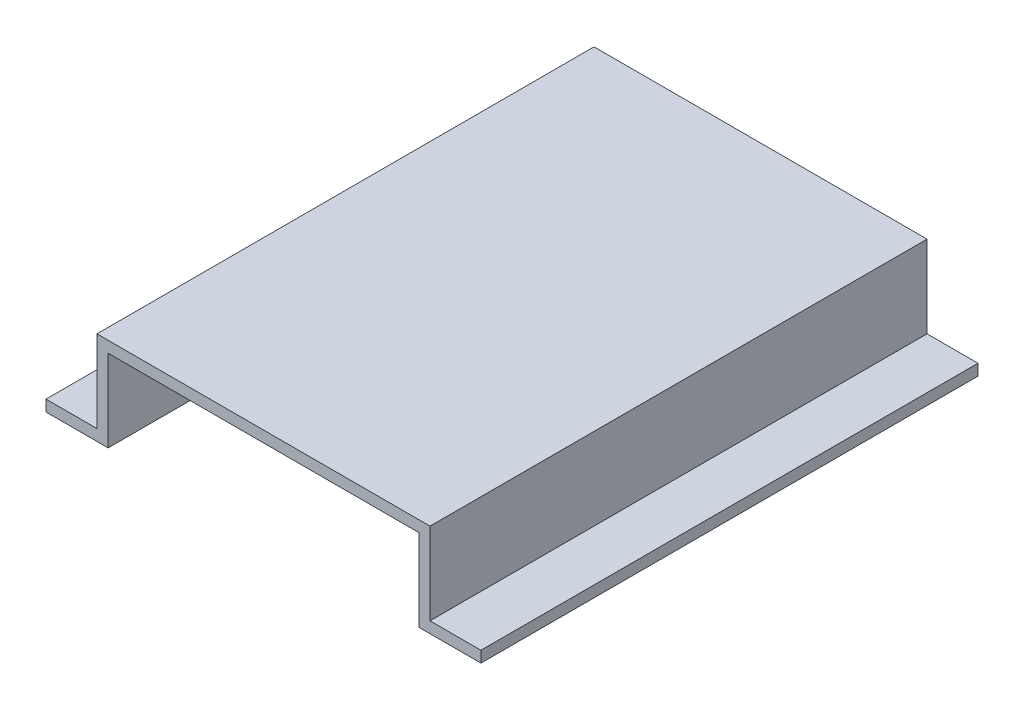
ISO-10303-21;
HEADER;
FILE_DESCRIPTION(('STEP AP214'),'2;1');
FILE_NAME('part.step','',(''),(''),'','','');
FILE_SCHEMA(('AUTOMOTIVE_DESIGN { 1 0 10303 214 1 1 1 1 }'));
ENDSEC;
DATA;
#1=APPLICATION_CONTEXT('core data for automotive mechanical design processes');
#2=APPLICATION_PROTOCOL_DEFINITION('international standard','automotive_design',2000,#1);
#3=PRODUCT_CONTEXT('',#1,'mechanical');
#4=PRODUCT('Part','Part','',(#3));
#5=PRODUCT_RELATED_PRODUCT_CATEGORY('part','',(#4));
#6=PRODUCT_DEFINITION_FORMATION('','',#4);
#7=PRODUCT_DEFINITION_CONTEXT('part definition',#1,'design');
#8=PRODUCT_DEFINITION('design','',#6,#7);
#9=PRODUCT_DEFINITION_SHAPE('','',#8);
#10=(LENGTH_UNIT() NAMED_UNIT(*) SI_UNIT(.MILLI.,.METRE.));
#11=(NAMED_UNIT(*) PLANE_ANGLE_UNIT() SI_UNIT($,.RADIAN.));
#12=(NAMED_UNIT(*) SI_UNIT($,.STERADIAN.) SOLID_ANGLE_UNIT());
#13=UNCERTAINTY_MEASURE_WITH_UNIT(LENGTH_MEASURE(1.E-05),#10,'distance_accuracy_value','');
#14=(GEOMETRIC_REPRESENTATION_CONTEXT(3) GLOBAL_UNCERTAINTY_ASSIGNED_CONTEXT((#13)) GLOBAL_UNIT_ASSIGNED_CONTEXT((#10,
#11,#12)) REPRESENTATION_CONTEXT('',''));
#15=CARTESIAN_POINT('',(0.,0.,0.));
#16=DIRECTION('',(0.,0.,1.));
#17=DIRECTION('',(1.,0.,0.));
#18=AXIS2_PLACEMENT_3D('',#15,#16,#17);
#19=CARTESIAN_POINT('',(-12.5,0.,40.));
#20=DIRECTION('',(-1.,0.,0.));
#21=DIRECTION('',(0.,-1.,0.));
#22=AXIS2_PLACEMENT_3D('',#19,#20,#21);
#23=PLANE('',#22);
#24=DIRECTION('',(0.,1.,0.));
#25=VECTOR('',#24,1.);
#26=CARTESIAN_POINT('',(-12.5,0.,0.));
#27=LINE('',#26,#25);
#28=CARTESIAN_POINT('',(-12.5,-6.6,0.));
#29=VERTEX_POINT('',#28);
#30=CARTESIAN_POINT('',(-12.5,0.,0.));
#31=VERTEX_POINT('',#30);
#32=EDGE_CURVE('E154',#29,#31,#27,.T.);
#33=ORIENTED_EDGE('',*,*,#32,.T.);
#34=DIRECTION('',(0.,0.,-1.));
#35=VECTOR('',#34,1.);
#36=CARTESIAN_POINT('',(-12.5,0.,40.));
#37=LINE('',#36,#35);
#38=CARTESIAN_POINT('',(-12.5,0.,40.));
#39=VERTEX_POINT('',#38);
#40=EDGE_CURVE('E11',#39,#31,#37,.T.);
#41=ORIENTED_EDGE('',*,*,#40,.F.);
#42=DIRECTION('',(0.,1.,0.));
#43=VECTOR('',#42,1.);
#44=CARTESIAN_POINT('',(-12.5,0.,40.));
#45=LINE('',#44,#43);
#46=CARTESIAN_POINT('',(-12.5,-6.6,40.));
#47=VERTEX_POINT('',#46);
#48=EDGE_CURVE('E176',#47,#39,#45,.T.);
#49=ORIENTED_EDGE('',*,*,#48,.F.);
#50=DIRECTION('',(0.,0.,-1.));
#51=VECTOR('',#50,1.);
#52=CARTESIAN_POINT('',(-12.5,-6.6,40.));
#53=LINE('',#52,#51);
#54=EDGE_CURVE('E150',#47,#29,#53,.T.);
#55=ORIENTED_EDGE('',*,*,#54,.T.);
#56=EDGE_LOOP('',(#33,#41,#49,#55));
#57=FACE_BOUND('',#56,.T.);
#58=ADVANCED_FACE('F34',(#57),#23,.F.);
#59=CARTESIAN_POINT('',(12.5,0.,40.));
#60=DIRECTION('',(0.,1.,0.));
#61=DIRECTION('',(-1.,0.,0.));
#62=AXIS2_PLACEMENT_3D('',#59,#60,#61);
#63=PLANE('',#62);
#64=DIRECTION('',(1.,0.,0.));
#65=VECTOR('',#64,1.);
#66=CARTESIAN_POINT('',(12.5,0.,0.));
#67=LINE('',#66,#65);
#68=CARTESIAN_POINT('',(12.5,0.,0.));
#69=VERTEX_POINT('',#68);
#70=EDGE_CURVE('E157',#31,#69,#67,.T.);
#71=ORIENTED_EDGE('',*,*,#70,.T.);
#72=DIRECTION('',(0.,0.,-1.));
#73=VECTOR('',#72,1.);
#74=CARTESIAN_POINT('',(12.5,0.,40.));
#75=LINE('',#74,#73);
#76=CARTESIAN_POINT('',(12.5,0.,40.));
#77=VERTEX_POINT('',#76);
#78=EDGE_CURVE('E42',#77,#69,#75,.T.);
#79=ORIENTED_EDGE('',*,*,#78,.F.);
#80=DIRECTION('',(1.,0.,0.));
#81=VECTOR('',#80,1.);
#82=CARTESIAN_POINT('',(12.5,0.,40.));
#83=LINE('',#82,#81);
#84=EDGE_CURVE('E105',#39,#77,#83,.T.);
#85=ORIENTED_EDGE('',*,*,#84,.F.);
#86=ORIENTED_EDGE('',*,*,#40,.T.);
#87=EDGE_LOOP('',(#71,#79,#85,#86));
#88=FACE_BOUND('',#87,.T.);
#89=ADVANCED_FACE('F254',(#88),#63,.F.);
#90=CARTESIAN_POINT('',(12.5,0.,40.));
#91=DIRECTION('',(1.,0.,0.));
#92=DIRECTION('',(0.,1.,0.));
#93=AXIS2_PLACEMENT_3D('',#90,#91,#92);
#94=PLANE('',#93);
#95=DIRECTION('',(0.,-1.,0.));
#96=VECTOR('',#95,1.);
#97=CARTESIAN_POINT('',(12.5,0.,0.));
#98=LINE('',#97,#96);
#99=CARTESIAN_POINT('',(12.5,-6.6,0.));
#100=VERTEX_POINT('',#99);
#101=EDGE_CURVE('E159',#69,#100,#98,.T.);
#102=ORIENTED_EDGE('',*,*,#101,.T.);
#103=DIRECTION('',(0.,0.,-1.));
#104=VECTOR('',#103,1.);
#105=CARTESIAN_POINT('',(12.5,-6.6,40.));
#106=LINE('',#105,#104);
#107=CARTESIAN_POINT('',(12.5,-6.6,40.));
#108=VERTEX_POINT('',#107);
#109=EDGE_CURVE('E195',#108,#100,#106,.T.);
#110=ORIENTED_EDGE('',*,*,#109,.F.);
#111=DIRECTION('',(0.,-1.,0.));
#112=VECTOR('',#111,1.);
#113=CARTESIAN_POINT('',(12.5,0.,40.));
#114=LINE('',#113,#112);
#115=EDGE_CURVE('E203',#77,#108,#114,.T.);
#116=ORIENTED_EDGE('',*,*,#115,.F.);
#117=ORIENTED_EDGE('',*,*,#78,.T.);
#118=EDGE_LOOP('',(#102,#110,#116,#117));
#119=FACE_BOUND('',#118,.T.);
#120=ADVANCED_FACE('F201',(#119),#94,.F.);
#121=CARTESIAN_POINT('',(12.5,-6.6,40.));
#122=DIRECTION('',(0.,1.,0.));
#123=DIRECTION('',(0.,0.,1.));
#124=AXIS2_PLACEMENT_3D('',#121,#122,#123);
#125=PLANE('',#124);
#126=DIRECTION('',(1.,0.,0.));
#127=VECTOR('',#126,1.);
#128=CARTESIAN_POINT('',(12.5,-6.6,0.));
#129=LINE('',#128,#127);
#130=CARTESIAN_POINT('',(17.5,-6.6,0.));
#131=VERTEX_POINT('',#130);
#132=EDGE_CURVE('E161',#100,#131,#129,.T.);
#133=ORIENTED_EDGE('',*,*,#132,.T.);
#134=DIRECTION('',(0.,0.,-1.));
#135=VECTOR('',#134,1.);
#136=CARTESIAN_POINT('',(17.5,-6.6,40.));
#137=LINE('',#136,#135);
#138=CARTESIAN_POINT('',(17.5,-6.6,40.));
#139=VERTEX_POINT('',#138);
#140=EDGE_CURVE('E192',#139,#131,#137,.T.);
#141=ORIENTED_EDGE('',*,*,#140,.F.);
#142=DIRECTION('',(1.,0.,0.));
#143=VECTOR('',#142,1.);
#144=CARTESIAN_POINT('',(12.5,-6.6,40.));
#145=LINE('',#144,#143);
#146=EDGE_CURVE('E221',#108,#139,#145,.T.);
#147=ORIENTED_EDGE('',*,*,#146,.F.);
#148=ORIENTED_EDGE('',*,*,#109,.T.);
#149=EDGE_LOOP('',(#133,#141,#147,#148));
#150=FACE_BOUND('',#149,.T.);
#151=ADVANCED_FACE('F212',(#150),#125,.F.);
#152=CARTESIAN_POINT('',(17.5,-6.6,40.));
#153=DIRECTION('',(-1.,0.,0.));
#154=DIRECTION('',(0.,0.,1.));
#155=AXIS2_PLACEMENT_3D('',#152,#153,#154);
#156=PLANE('',#155);
#157=DIRECTION('',(0.,1.,0.));
#158=VECTOR('',#157,1.);
#159=CARTESIAN_POINT('',(17.5,-6.6,0.));
#160=LINE('',#159,#158);
#161=CARTESIAN_POINT('',(17.5,-5.7,0.));
#162=VERTEX_POINT('',#161);
#163=EDGE_CURVE('E163',#131,#162,#160,.T.);
#164=ORIENTED_EDGE('',*,*,#163,.T.);
#165=DIRECTION('',(0.,0.,-1.));
#166=VECTOR('',#165,1.);
#167=CARTESIAN_POINT('',(17.5,-5.7,40.));
#168=LINE('',#167,#166);
#169=CARTESIAN_POINT('',(17.5,-5.7,40.));
#170=VERTEX_POINT('',#169);
#171=EDGE_CURVE('E189',#170,#162,#168,.T.);
#172=ORIENTED_EDGE('',*,*,#171,.F.);
#173=DIRECTION('',(0.,1.,0.));
#174=VECTOR('',#173,1.);
#175=CARTESIAN_POINT('',(17.5,-6.6,40.));
#176=LINE('',#175,#174);
#177=EDGE_CURVE('E218',#139,#170,#176,.T.);
#178=ORIENTED_EDGE('',*,*,#177,.F.);
#179=ORIENTED_EDGE('',*,*,#140,.T.);
#180=EDGE_LOOP('',(#164,#172,#178,#179));
#181=FACE_BOUND('',#180,.T.);
#182=ADVANCED_FACE('F216',(#181),#156,.F.);
#183=CARTESIAN_POINT('',(13.4,-5.7,40.));
#184=DIRECTION('',(0.,-1.,0.));
#185=DIRECTION('',(1.,0.,0.));
#186=AXIS2_PLACEMENT_3D('',#183,#184,#185);
#187=PLANE('',#186);
#188=DIRECTION('',(-1.,0.,0.));
#189=VECTOR('',#188,1.);
#190=CARTESIAN_POINT('',(13.4,-5.7,0.));
#191=LINE('',#190,#189);
#192=CARTESIAN_POINT('',(13.4,-5.7,0.));
#193=VERTEX_POINT('',#192);
#194=EDGE_CURVE('E165',#162,#193,#191,.T.);
#195=ORIENTED_EDGE('',*,*,#194,.T.);
#196=DIRECTION('',(0.,0.,-1.));
#197=VECTOR('',#196,1.);
#198=CARTESIAN_POINT('',(13.4,-5.7,40.));
#199=LINE('',#198,#197);
#200=CARTESIAN_POINT('',(13.4,-5.7,40.));
#201=VERTEX_POINT('',#200);
#202=EDGE_CURVE('E186',#201,#193,#199,.T.);
#203=ORIENTED_EDGE('',*,*,#202,.F.);
#204=DIRECTION('',(-1.,0.,0.));
#205=VECTOR('',#204,1.);
#206=CARTESIAN_POINT('',(13.4,-5.7,40.));
#207=LINE('',#206,#205);
#208=EDGE_CURVE('E220',#170,#201,#207,.T.);
#209=ORIENTED_EDGE('',*,*,#208,.F.);
#210=ORIENTED_EDGE('',*,*,#171,.T.);
#211=EDGE_LOOP('',(#195,#203,#209,#210));
#212=FACE_BOUND('',#211,.T.);
#213=ADVANCED_FACE('F267',(#212),#187,.F.);
#214=CARTESIAN_POINT('',(13.4,0.9,40.));
#215=DIRECTION('',(-1.,0.,0.));
#216=DIRECTION('',(0.,0.,1.));
#217=AXIS2_PLACEMENT_3D('',#214,#215,#216);
#218=PLANE('',#217);
#219=DIRECTION('',(0.,1.,0.));
#220=VECTOR('',#219,1.);
#221=CARTESIAN_POINT('',(13.4,0.9,0.));
#222=LINE('',#221,#220);
#223=CARTESIAN_POINT('',(13.4,0.9,0.));
#224=VERTEX_POINT('',#223);
#225=EDGE_CURVE('E167',#193,#224,#222,.T.);
#226=ORIENTED_EDGE('',*,*,#225,.T.);
#227=DIRECTION('',(0.,0.,-1.));
#228=VECTOR('',#227,1.);
#229=CARTESIAN_POINT('',(13.4,0.9,40.));
#230=LINE('',#229,#228);
#231=CARTESIAN_POINT('',(13.4,0.9,40.));
#232=VERTEX_POINT('',#231);
#233=EDGE_CURVE('E183',#232,#224,#230,.T.);
#234=ORIENTED_EDGE('',*,*,#233,.F.);
#235=DIRECTION('',(0.,1.,0.));
#236=VECTOR('',#235,1.);
#237=CARTESIAN_POINT('',(13.4,0.9,40.));
#238=LINE('',#237,#236);
#239=EDGE_CURVE('E223',#201,#232,#238,.T.);
#240=ORIENTED_EDGE('',*,*,#239,.F.);
#241=ORIENTED_EDGE('',*,*,#202,.T.);
#242=EDGE_LOOP('',(#226,#234,#240,#241));
#243=FACE_BOUND('',#242,.T.);
#244=ADVANCED_FACE('F270',(#243),#218,.F.);
#245=CARTESIAN_POINT('',(13.4,0.9,40.));
#246=DIRECTION('',(0.,-1.,0.));
#247=DIRECTION('',(0.,0.,-1.));
#248=AXIS2_PLACEMENT_3D('',#245,#246,#247);
#249=PLANE('',#248);
#250=DIRECTION('',(-1.,0.,0.));
#251=VECTOR('',#250,1.);
#252=CARTESIAN_POINT('',(13.4,0.9,0.));
#253=LINE('',#252,#251);
#254=CARTESIAN_POINT('',(-13.4,0.9,0.));
#255=VERTEX_POINT('',#254);
#256=EDGE_CURVE('E169',#224,#255,#253,.T.);
#257=ORIENTED_EDGE('',*,*,#256,.T.);
#258=DIRECTION('',(0.,0.,-1.));
#259=VECTOR('',#258,1.);
#260=CARTESIAN_POINT('',(-13.4,0.9,40.));
#261=LINE('',#260,#259);
#262=CARTESIAN_POINT('',(-13.4,0.9,40.));
#263=VERTEX_POINT('',#262);
#264=EDGE_CURVE('E180',#263,#255,#261,.T.);
#265=ORIENTED_EDGE('',*,*,#264,.F.);
#266=DIRECTION('',(-1.,0.,0.));
#267=VECTOR('',#266,1.);
#268=CARTESIAN_POINT('',(13.4,0.9,40.));
#269=LINE('',#268,#267);
#270=EDGE_CURVE('E229',#232,#263,#269,.T.);
#271=ORIENTED_EDGE('',*,*,#270,.F.);
#272=ORIENTED_EDGE('',*,*,#233,.T.);
#273=EDGE_LOOP('',(#257,#265,#271,#272));
#274=FACE_BOUND('',#273,.T.);
#275=ADVANCED_FACE('F235',(#274),#249,.F.);
#276=CARTESIAN_POINT('',(-13.4,0.9,40.));
#277=DIRECTION('',(1.,0.,0.));
#278=DIRECTION('',(0.,0.,-1.));
#279=AXIS2_PLACEMENT_3D('',#276,#277,#278);
#280=PLANE('',#279);
#281=DIRECTION('',(0.,-1.,0.));
#282=VECTOR('',#281,1.);
#283=CARTESIAN_POINT('',(-13.4,0.9,0.));
#284=LINE('',#283,#282);
#285=CARTESIAN_POINT('',(-13.4,-5.7,0.));
#286=VERTEX_POINT('',#285);
#287=EDGE_CURVE('E171',#255,#286,#284,.T.);
#288=ORIENTED_EDGE('',*,*,#287,.T.);
#289=DIRECTION('',(0.,0.,-1.));
#290=VECTOR('',#289,1.);
#291=CARTESIAN_POINT('',(-13.4,-5.7,40.));
#292=LINE('',#291,#290);
#293=CARTESIAN_POINT('',(-13.4,-5.7,40.));
#294=VERTEX_POINT('',#293);
#295=EDGE_CURVE('E145',#294,#286,#292,.T.);
#296=ORIENTED_EDGE('',*,*,#295,.F.);
#297=DIRECTION('',(0.,-1.,0.));
#298=VECTOR('',#297,1.);
#299=CARTESIAN_POINT('',(-13.4,0.9,40.));
#300=LINE('',#299,#298);
#301=EDGE_CURVE('E136',#263,#294,#300,.T.);
#302=ORIENTED_EDGE('',*,*,#301,.F.);
#303=ORIENTED_EDGE('',*,*,#264,.T.);
#304=EDGE_LOOP('',(#288,#296,#302,#303));
#305=FACE_BOUND('',#304,.T.);
#306=ADVANCED_FACE('F239',(#305),#280,.F.);
#307=CARTESIAN_POINT('',(-13.4,-5.7,40.));
#308=DIRECTION('',(0.,-1.,0.));
#309=DIRECTION('',(1.,0.,0.));
#310=AXIS2_PLACEMENT_3D('',#307,#308,#309);
#311=PLANE('',#310);
#312=DIRECTION('',(-1.,0.,0.));
#313=VECTOR('',#312,1.);
#314=CARTESIAN_POINT('',(-13.4,-5.7,0.));
#315=LINE('',#314,#313);
#316=CARTESIAN_POINT('',(-17.5,-5.7,0.));
#317=VERTEX_POINT('',#316);
#318=EDGE_CURVE('E144',#286,#317,#315,.T.);
#319=ORIENTED_EDGE('',*,*,#318,.T.);
#320=DIRECTION('',(0.,0.,-1.));
#321=VECTOR('',#320,1.);
#322=CARTESIAN_POINT('',(-17.5,-5.7,40.));
#323=LINE('',#322,#321);
#324=CARTESIAN_POINT('',(-17.5,-5.7,40.));
#325=VERTEX_POINT('',#324);
#326=EDGE_CURVE('E141',#325,#317,#323,.T.);
#327=ORIENTED_EDGE('',*,*,#326,.F.);
#328=DIRECTION('',(-1.,0.,0.));
#329=VECTOR('',#328,1.);
#330=CARTESIAN_POINT('',(-13.4,-5.7,40.));
#331=LINE('',#330,#329);
#332=EDGE_CURVE('E130',#294,#325,#331,.T.);
#333=ORIENTED_EDGE('',*,*,#332,.F.);
#334=ORIENTED_EDGE('',*,*,#295,.T.);
#335=EDGE_LOOP('',(#319,#327,#333,#334));
#336=FACE_BOUND('',#335,.T.);
#337=ADVANCED_FACE('F142',(#336),#311,.F.);
#338=CARTESIAN_POINT('',(-17.5,-6.6,40.));
#339=DIRECTION('',(1.,0.,0.));
#340=DIRECTION('',(0.,0.,-1.));
#341=AXIS2_PLACEMENT_3D('',#338,#339,#340);
#342=PLANE('',#341);
#343=DIRECTION('',(0.,-1.,0.));
#344=VECTOR('',#343,1.);
#345=CARTESIAN_POINT('',(-17.5,-6.6,0.));
#346=LINE('',#345,#344);
#347=CARTESIAN_POINT('',(-17.5,-6.6,0.));
#348=VERTEX_POINT('',#347);
#349=EDGE_CURVE('E91',#317,#348,#346,.T.);
#350=ORIENTED_EDGE('',*,*,#349,.T.);
#351=DIRECTION('',(0.,0.,-1.));
#352=VECTOR('',#351,1.);
#353=CARTESIAN_POINT('',(-17.5,-6.6,40.));
#354=LINE('',#353,#352);
#355=CARTESIAN_POINT('',(-17.5,-6.6,40.));
#356=VERTEX_POINT('',#355);
#357=EDGE_CURVE('E146',#356,#348,#354,.T.);
#358=ORIENTED_EDGE('',*,*,#357,.F.);
#359=DIRECTION('',(0.,-1.,0.));
#360=VECTOR('',#359,1.);
#361=CARTESIAN_POINT('',(-17.5,-6.6,40.));
#362=LINE('',#361,#360);
#363=EDGE_CURVE('E134',#325,#356,#362,.T.);
#364=ORIENTED_EDGE('',*,*,#363,.F.);
#365=ORIENTED_EDGE('',*,*,#326,.T.);
#366=EDGE_LOOP('',(#350,#358,#364,#365));
#367=FACE_BOUND('',#366,.T.);
#368=ADVANCED_FACE('F148',(#367),#342,.F.);
#369=CARTESIAN_POINT('',(-12.5,-6.6,40.));
#370=DIRECTION('',(0.,1.,0.));
#371=DIRECTION('',(-1.,0.,0.));
#372=AXIS2_PLACEMENT_3D('',#369,#370,#371);
#373=PLANE('',#372);
#374=DIRECTION('',(1.,0.,0.));
#375=VECTOR('',#374,1.);
#376=CARTESIAN_POINT('',(-12.5,-6.6,0.));
#377=LINE('',#376,#375);
#378=EDGE_CURVE('E97',#348,#29,#377,.T.);
#379=ORIENTED_EDGE('',*,*,#378,.T.);
#380=ORIENTED_EDGE('',*,*,#54,.F.);
#381=DIRECTION('',(1.,0.,0.));
#382=VECTOR('',#381,1.);
#383=CARTESIAN_POINT('',(-12.5,-6.6,40.));
#384=LINE('',#383,#382);
#385=EDGE_CURVE('E50',#356,#47,#384,.T.);
#386=ORIENTED_EDGE('',*,*,#385,.F.);
#387=ORIENTED_EDGE('',*,*,#357,.T.);
#388=EDGE_LOOP('',(#379,#380,#386,#387));
#389=FACE_BOUND('',#388,.T.);
#390=ADVANCED_FACE('F243',(#389),#373,.F.);
#391=CARTESIAN_POINT('',(0.,0.,40.));
#392=DIRECTION('',(0.,0.,-1.));
#393=DIRECTION('',(-1.,0.,0.));
#394=AXIS2_PLACEMENT_3D('',#391,#392,#393);
#395=PLANE('',#394);
#396=ORIENTED_EDGE('',*,*,#48,.T.);
#397=ORIENTED_EDGE('',*,*,#84,.T.);
#398=ORIENTED_EDGE('',*,*,#115,.T.);
#399=ORIENTED_EDGE('',*,*,#146,.T.);
#400=ORIENTED_EDGE('',*,*,#177,.T.);
#401=ORIENTED_EDGE('',*,*,#208,.T.);
#402=ORIENTED_EDGE('',*,*,#239,.T.);
#403=ORIENTED_EDGE('',*,*,#270,.T.);
#404=ORIENTED_EDGE('',*,*,#301,.T.);
#405=ORIENTED_EDGE('',*,*,#332,.T.);
#406=ORIENTED_EDGE('',*,*,#363,.T.);
#407=ORIENTED_EDGE('',*,*,#385,.T.);
#408=EDGE_LOOP('',(#396,#397,#398,#399,#400,#401,#402,#403,#404,#405,#406,#407));
#409=FACE_BOUND('',#408,.T.);
#410=ADVANCED_FACE('F132',(#409),#395,.F.);
#411=CARTESIAN_POINT('',(0.,0.,0.));
#412=DIRECTION('',(0.,0.,-1.));
#413=DIRECTION('',(-1.,0.,0.));
#414=AXIS2_PLACEMENT_3D('',#411,#412,#413);
#415=PLANE('',#414);
#416=ORIENTED_EDGE('',*,*,#32,.F.);
#417=ORIENTED_EDGE('',*,*,#378,.F.);
#418=ORIENTED_EDGE('',*,*,#349,.F.);
#419=ORIENTED_EDGE('',*,*,#318,.F.);
#420=ORIENTED_EDGE('',*,*,#287,.F.);
#421=ORIENTED_EDGE('',*,*,#256,.F.);
#422=ORIENTED_EDGE('',*,*,#225,.F.);
#423=ORIENTED_EDGE('',*,*,#194,.F.);
#424=ORIENTED_EDGE('',*,*,#163,.F.);
#425=ORIENTED_EDGE('',*,*,#132,.F.);
#426=ORIENTED_EDGE('',*,*,#101,.F.);
#427=ORIENTED_EDGE('',*,*,#70,.F.);
#428=EDGE_LOOP('',(#416,#417,#418,#419,#420,#421,#422,#423,#424,#425,#426,#427));
#429=FACE_BOUND('',#428,.T.);
#430=ADVANCED_FACE('F207',(#429),#415,.T.);
#431=CLOSED_SHELL('',(#58,#89,#120,#151,#182,#213,#244,#275,#306,#337,#368,#390,#410,#430));
#432=MANIFOLD_SOLID_BREP('B2',#431);
#433=ADVANCED_BREP_SHAPE_REPRESENTATION('',(#18,#432),#14);
#434=SHAPE_DEFINITION_REPRESENTATION(#9,#433);
ENDSEC;
END-ISO-10303-21;
